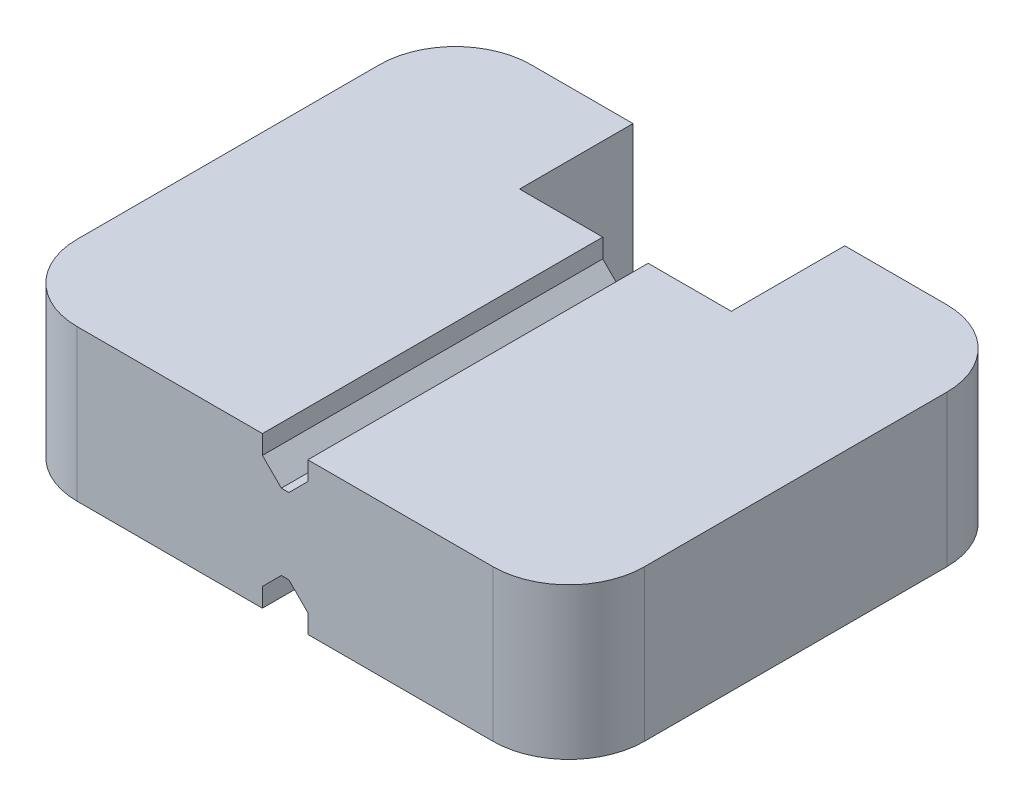
ISO-10303-21;
HEADER;
FILE_DESCRIPTION(('STEP AP214'),'2;1');
FILE_NAME('part.step','',(''),(''),'','','');
FILE_SCHEMA(('AUTOMOTIVE_DESIGN { 1 0 10303 214 1 1 1 1 }'));
ENDSEC;
DATA;
#1=APPLICATION_CONTEXT('core data for automotive mechanical design processes');
#2=APPLICATION_PROTOCOL_DEFINITION('international standard','automotive_design',2000,#1);
#3=PRODUCT_CONTEXT('',#1,'mechanical');
#4=PRODUCT('Part','Part','',(#3));
#5=PRODUCT_RELATED_PRODUCT_CATEGORY('part','',(#4));
#6=PRODUCT_DEFINITION_FORMATION('','',#4);
#7=PRODUCT_DEFINITION_CONTEXT('part definition',#1,'design');
#8=PRODUCT_DEFINITION('design','',#6,#7);
#9=PRODUCT_DEFINITION_SHAPE('','',#8);
#10=(LENGTH_UNIT() NAMED_UNIT(*) SI_UNIT(.MILLI.,.METRE.));
#11=(NAMED_UNIT(*) PLANE_ANGLE_UNIT() SI_UNIT($,.RADIAN.));
#12=(NAMED_UNIT(*) SI_UNIT($,.STERADIAN.) SOLID_ANGLE_UNIT());
#13=UNCERTAINTY_MEASURE_WITH_UNIT(LENGTH_MEASURE(1.E-05),#10,'distance_accuracy_value','');
#14=(GEOMETRIC_REPRESENTATION_CONTEXT(3) GLOBAL_UNCERTAINTY_ASSIGNED_CONTEXT((#13)) GLOBAL_UNIT_ASSIGNED_CONTEXT((#10,
#11,#12)) REPRESENTATION_CONTEXT('',''));
#15=CARTESIAN_POINT('',(0.,0.,0.));
#16=DIRECTION('',(0.,0.,1.));
#17=DIRECTION('',(1.,0.,0.));
#18=AXIS2_PLACEMENT_3D('',#15,#16,#17);
#19=CARTESIAN_POINT('',(0.,0.,0.));
#20=DIRECTION('',(0.,1.,0.));
#21=DIRECTION('',(0.,0.,1.));
#22=AXIS2_PLACEMENT_3D('',#19,#20,#21);
#23=PLANE('',#22);
#24=DIRECTION('',(1.,0.,0.));
#25=VECTOR('',#24,1.);
#26=CARTESIAN_POINT('',(-7.5,0.,6.));
#27=LINE('',#26,#25);
#28=CARTESIAN_POINT('',(0.6,0.,6.));
#29=VERTEX_POINT('',#28);
#30=CARTESIAN_POINT('',(5.49999999999999,0.,6.));
#31=VERTEX_POINT('',#30);
#32=EDGE_CURVE('E262',#29,#31,#27,.T.);
#33=ORIENTED_EDGE('',*,*,#32,.F.);
#34=DIRECTION('',(0.,0.,1.));
#35=VECTOR('',#34,1.);
#36=CARTESIAN_POINT('',(0.6,0.,7.));
#37=LINE('',#36,#35);
#38=CARTESIAN_POINT('',(0.600000000000001,0.,-3.));
#39=VERTEX_POINT('',#38);
#40=EDGE_CURVE('E209',#39,#29,#37,.T.);
#41=ORIENTED_EDGE('',*,*,#40,.F.);
#42=DIRECTION('',(1.,0.,0.));
#43=VECTOR('',#42,1.);
#44=CARTESIAN_POINT('',(-2.8,0.,-3.));
#45=LINE('',#44,#43);
#46=CARTESIAN_POINT('',(2.8,0.,-3.));
#47=VERTEX_POINT('',#46);
#48=EDGE_CURVE('E216',#39,#47,#45,.T.);
#49=ORIENTED_EDGE('',*,*,#48,.T.);
#50=DIRECTION('',(0.,0.,-1.));
#51=VECTOR('',#50,1.);
#52=CARTESIAN_POINT('',(2.8,0.,-9.));
#53=LINE('',#52,#51);
#54=CARTESIAN_POINT('',(2.8,0.,-6.));
#55=VERTEX_POINT('',#54);
#56=EDGE_CURVE('E220',#47,#55,#53,.T.);
#57=ORIENTED_EDGE('',*,*,#56,.T.);
#58=DIRECTION('',(-1.,0.,0.));
#59=VECTOR('',#58,1.);
#60=CARTESIAN_POINT('',(-7.5,0.,-6.));
#61=LINE('',#60,#59);
#62=CARTESIAN_POINT('',(5.5,0.,-6.));
#63=VERTEX_POINT('',#62);
#64=EDGE_CURVE('E258',#63,#55,#61,.T.);
#65=ORIENTED_EDGE('',*,*,#64,.F.);
#66=CARTESIAN_POINT('',(5.5,0.,-4.));
#67=DIRECTION('',(0.,1.,0.));
#68=DIRECTION('',(0.,0.,1.));
#69=AXIS2_PLACEMENT_3D('',#66,#67,#68);
#70=CIRCLE('',#69,2.);
#71=CARTESIAN_POINT('',(7.5,0.,-4.));
#72=VERTEX_POINT('',#71);
#73=EDGE_CURVE('E302',#63,#72,#70,.F.);
#74=ORIENTED_EDGE('',*,*,#73,.T.);
#75=DIRECTION('',(0.,0.,-1.));
#76=VECTOR('',#75,1.);
#77=CARTESIAN_POINT('',(7.5,0.,-6.));
#78=LINE('',#77,#76);
#79=CARTESIAN_POINT('',(7.5,0.,4.));
#80=VERTEX_POINT('',#79);
#81=EDGE_CURVE('E242',#80,#72,#78,.T.);
#82=ORIENTED_EDGE('',*,*,#81,.F.);
#83=CARTESIAN_POINT('',(5.5,0.,4.));
#84=DIRECTION('',(0.,1.,0.));
#85=DIRECTION('',(0.,0.,1.));
#86=AXIS2_PLACEMENT_3D('',#83,#84,#85);
#87=CIRCLE('',#86,2.);
#88=EDGE_CURVE('E291',#80,#31,#87,.F.);
#89=ORIENTED_EDGE('',*,*,#88,.T.);
#90=EDGE_LOOP('',(#33,#41,#49,#57,#65,#74,#82,#89));
#91=FACE_BOUND('',#90,.T.);
#92=ADVANCED_FACE('F35',(#91),#23,.F.);
#93=CARTESIAN_POINT('',(-5.5,4.,-4.));
#94=DIRECTION('',(0.,1.,0.));
#95=DIRECTION('',(0.,0.,1.));
#96=AXIS2_PLACEMENT_3D('',#93,#94,#95);
#97=CYLINDRICAL_SURFACE('',#96,2.);
#98=DIRECTION('',(0.,1.,0.));
#99=VECTOR('',#98,1.);
#100=CARTESIAN_POINT('',(-5.5,4.,-6.));
#101=LINE('',#100,#99);
#102=CARTESIAN_POINT('',(-5.5,0.,-6.));
#103=VERTEX_POINT('',#102);
#104=CARTESIAN_POINT('',(-5.5,4.,-6.));
#105=VERTEX_POINT('',#104);
#106=EDGE_CURVE('E315',#103,#105,#101,.T.);
#107=ORIENTED_EDGE('',*,*,#106,.F.);
#108=CARTESIAN_POINT('',(-5.5,0.,-4.));
#109=DIRECTION('',(0.,1.,0.));
#110=DIRECTION('',(0.,0.,1.));
#111=AXIS2_PLACEMENT_3D('',#108,#109,#110);
#112=CIRCLE('',#111,2.);
#113=CARTESIAN_POINT('',(-7.5,0.,-4.));
#114=VERTEX_POINT('',#113);
#115=EDGE_CURVE('E321',#114,#103,#112,.F.);
#116=ORIENTED_EDGE('',*,*,#115,.F.);
#117=DIRECTION('',(0.,1.,0.));
#118=VECTOR('',#117,1.);
#119=CARTESIAN_POINT('',(-7.5,4.,-4.));
#120=LINE('',#119,#118);
#121=CARTESIAN_POINT('',(-7.5,4.,-4.));
#122=VERTEX_POINT('',#121);
#123=EDGE_CURVE('E318',#122,#114,#120,.F.);
#124=ORIENTED_EDGE('',*,*,#123,.F.);
#125=CARTESIAN_POINT('',(-5.5,4.,-4.));
#126=DIRECTION('',(0.,1.,0.));
#127=DIRECTION('',(0.,0.,1.));
#128=AXIS2_PLACEMENT_3D('',#125,#126,#127);
#129=CIRCLE('',#128,2.);
#130=EDGE_CURVE('E323',#105,#122,#129,.T.);
#131=ORIENTED_EDGE('',*,*,#130,.F.);
#132=EDGE_LOOP('',(#107,#116,#124,#131));
#133=FACE_BOUND('',#132,.T.);
#134=ADVANCED_FACE('F421',(#133),#97,.T.);
#135=CARTESIAN_POINT('',(-5.5,4.,4.));
#136=DIRECTION('',(0.,1.,0.));
#137=DIRECTION('',(0.,0.,1.));
#138=AXIS2_PLACEMENT_3D('',#135,#136,#137);
#139=CYLINDRICAL_SURFACE('',#138,2.);
#140=DIRECTION('',(0.,1.,0.));
#141=VECTOR('',#140,1.);
#142=CARTESIAN_POINT('',(-7.5,4.,4.));
#143=LINE('',#142,#141);
#144=CARTESIAN_POINT('',(-7.5,0.,4.));
#145=VERTEX_POINT('',#144);
#146=CARTESIAN_POINT('',(-7.5,4.,4.));
#147=VERTEX_POINT('',#146);
#148=EDGE_CURVE('E304',#145,#147,#143,.T.);
#149=ORIENTED_EDGE('',*,*,#148,.F.);
#150=CARTESIAN_POINT('',(-5.5,0.,4.));
#151=DIRECTION('',(0.,1.,0.));
#152=DIRECTION('',(0.,0.,1.));
#153=AXIS2_PLACEMENT_3D('',#150,#151,#152);
#154=CIRCLE('',#153,2.);
#155=CARTESIAN_POINT('',(-5.5,0.,6.));
#156=VERTEX_POINT('',#155);
#157=EDGE_CURVE('E310',#156,#145,#154,.F.);
#158=ORIENTED_EDGE('',*,*,#157,.F.);
#159=DIRECTION('',(0.,1.,0.));
#160=VECTOR('',#159,1.);
#161=CARTESIAN_POINT('',(-5.5,4.,6.));
#162=LINE('',#161,#160);
#163=CARTESIAN_POINT('',(-5.5,4.,6.));
#164=VERTEX_POINT('',#163);
#165=EDGE_CURVE('E307',#164,#156,#162,.F.);
#166=ORIENTED_EDGE('',*,*,#165,.F.);
#167=CARTESIAN_POINT('',(-5.5,4.,4.));
#168=DIRECTION('',(0.,1.,0.));
#169=DIRECTION('',(0.,0.,1.));
#170=AXIS2_PLACEMENT_3D('',#167,#168,#169);
#171=CIRCLE('',#170,2.);
#172=EDGE_CURVE('E313',#147,#164,#171,.T.);
#173=ORIENTED_EDGE('',*,*,#172,.F.);
#174=EDGE_LOOP('',(#149,#158,#166,#173));
#175=FACE_BOUND('',#174,.T.);
#176=ADVANCED_FACE('F429',(#175),#139,.T.);
#177=CARTESIAN_POINT('',(5.5,4.,-4.));
#178=DIRECTION('',(0.,-1.,0.));
#179=DIRECTION('',(0.,0.,-1.));
#180=AXIS2_PLACEMENT_3D('',#177,#178,#179);
#181=CYLINDRICAL_SURFACE('',#180,2.);
#182=DIRECTION('',(0.,-1.,0.));
#183=VECTOR('',#182,1.);
#184=CARTESIAN_POINT('',(5.5,4.,-6.));
#185=LINE('',#184,#183);
#186=CARTESIAN_POINT('',(5.5,4.,-6.));
#187=VERTEX_POINT('',#186);
#188=EDGE_CURVE('E294',#187,#63,#185,.T.);
#189=ORIENTED_EDGE('',*,*,#188,.F.);
#190=CARTESIAN_POINT('',(5.5,4.,-4.));
#191=DIRECTION('',(0.,1.,0.));
#192=DIRECTION('',(0.,0.,1.));
#193=AXIS2_PLACEMENT_3D('',#190,#191,#192);
#194=CIRCLE('',#193,2.);
#195=CARTESIAN_POINT('',(7.5,4.,-4.));
#196=VERTEX_POINT('',#195);
#197=EDGE_CURVE('E300',#196,#187,#194,.T.);
#198=ORIENTED_EDGE('',*,*,#197,.F.);
#199=DIRECTION('',(0.,-1.,0.));
#200=VECTOR('',#199,1.);
#201=CARTESIAN_POINT('',(7.5,4.,-4.));
#202=LINE('',#201,#200);
#203=EDGE_CURVE('E297',#72,#196,#202,.F.);
#204=ORIENTED_EDGE('',*,*,#203,.F.);
#205=ORIENTED_EDGE('',*,*,#73,.F.);
#206=EDGE_LOOP('',(#189,#198,#204,#205));
#207=FACE_BOUND('',#206,.T.);
#208=ADVANCED_FACE('F470',(#207),#181,.T.);
#209=CARTESIAN_POINT('',(5.5,4.,4.));
#210=DIRECTION('',(0.,-1.,0.));
#211=DIRECTION('',(0.,0.,-1.));
#212=AXIS2_PLACEMENT_3D('',#209,#210,#211);
#213=CYLINDRICAL_SURFACE('',#212,2.);
#214=DIRECTION('',(0.,-1.,0.));
#215=VECTOR('',#214,1.);
#216=CARTESIAN_POINT('',(7.5,4.,4.));
#217=LINE('',#216,#215);
#218=CARTESIAN_POINT('',(7.5,4.,4.));
#219=VERTEX_POINT('',#218);
#220=EDGE_CURVE('E283',#219,#80,#217,.T.);
#221=ORIENTED_EDGE('',*,*,#220,.F.);
#222=CARTESIAN_POINT('',(5.5,4.,4.));
#223=DIRECTION('',(0.,1.,0.));
#224=DIRECTION('',(0.,0.,1.));
#225=AXIS2_PLACEMENT_3D('',#222,#223,#224);
#226=CIRCLE('',#225,2.);
#227=CARTESIAN_POINT('',(5.49999999999999,4.,6.));
#228=VERTEX_POINT('',#227);
#229=EDGE_CURVE('E289',#228,#219,#226,.T.);
#230=ORIENTED_EDGE('',*,*,#229,.F.);
#231=DIRECTION('',(0.,-1.,0.));
#232=VECTOR('',#231,1.);
#233=CARTESIAN_POINT('',(5.5,4.,6.));
#234=LINE('',#233,#232);
#235=EDGE_CURVE('E286',#31,#228,#234,.F.);
#236=ORIENTED_EDGE('',*,*,#235,.F.);
#237=ORIENTED_EDGE('',*,*,#88,.F.);
#238=EDGE_LOOP('',(#221,#230,#236,#237));
#239=FACE_BOUND('',#238,.T.);
#240=ADVANCED_FACE('F461',(#239),#213,.T.);
#241=CARTESIAN_POINT('',(0.,4.,0.));
#242=DIRECTION('',(0.,1.,0.));
#243=DIRECTION('',(0.,0.,1.));
#244=AXIS2_PLACEMENT_3D('',#241,#242,#243);
#245=PLANE('',#244);
#246=DIRECTION('',(0.,0.,-1.));
#247=VECTOR('',#246,1.);
#248=CARTESIAN_POINT('',(7.5,4.,-6.));
#249=LINE('',#248,#247);
#250=EDGE_CURVE('E243',#219,#196,#249,.T.);
#251=ORIENTED_EDGE('',*,*,#250,.T.);
#252=ORIENTED_EDGE('',*,*,#197,.T.);
#253=DIRECTION('',(-1.,0.,0.));
#254=VECTOR('',#253,1.);
#255=CARTESIAN_POINT('',(-7.5,4.,-6.));
#256=LINE('',#255,#254);
#257=CARTESIAN_POINT('',(2.8,4.,-6.));
#258=VERTEX_POINT('',#257);
#259=EDGE_CURVE('E248',#187,#258,#256,.T.);
#260=ORIENTED_EDGE('',*,*,#259,.T.);
#261=DIRECTION('',(0.,0.,-1.));
#262=VECTOR('',#261,1.);
#263=CARTESIAN_POINT('',(2.8,4.,-9.));
#264=LINE('',#263,#262);
#265=CARTESIAN_POINT('',(2.8,4.,-3.));
#266=VERTEX_POINT('',#265);
#267=EDGE_CURVE('E224',#266,#258,#264,.T.);
#268=ORIENTED_EDGE('',*,*,#267,.F.);
#269=DIRECTION('',(1.,0.,0.));
#270=VECTOR('',#269,1.);
#271=CARTESIAN_POINT('',(-2.8,4.,-3.));
#272=LINE('',#271,#270);
#273=CARTESIAN_POINT('',(0.600000000000004,4.,-3.));
#274=VERTEX_POINT('',#273);
#275=EDGE_CURVE('E230',#274,#266,#272,.T.);
#276=ORIENTED_EDGE('',*,*,#275,.F.);
#277=DIRECTION('',(0.,0.,-1.));
#278=VECTOR('',#277,1.);
#279=CARTESIAN_POINT('',(0.600000000000004,4.,7.));
#280=LINE('',#279,#278);
#281=CARTESIAN_POINT('',(0.600000000000004,4.,6.));
#282=VERTEX_POINT('',#281);
#283=EDGE_CURVE('E360',#282,#274,#280,.T.);
#284=ORIENTED_EDGE('',*,*,#283,.F.);
#285=DIRECTION('',(1.,0.,0.));
#286=VECTOR('',#285,1.);
#287=CARTESIAN_POINT('',(-7.5,4.,6.));
#288=LINE('',#287,#286);
#289=EDGE_CURVE('E252',#282,#228,#288,.T.);
#290=ORIENTED_EDGE('',*,*,#289,.T.);
#291=ORIENTED_EDGE('',*,*,#229,.T.);
#292=EDGE_LOOP('',(#251,#252,#260,#268,#276,#284,#290,#291));
#293=FACE_BOUND('',#292,.T.);
#294=ADVANCED_FACE('F455',(#293),#245,.T.);
#295=CARTESIAN_POINT('',(-7.5,4.,-6.));
#296=DIRECTION('',(0.,0.,1.));
#297=DIRECTION('',(1.,0.,0.));
#298=AXIS2_PLACEMENT_3D('',#295,#296,#297);
#299=PLANE('',#298);
#300=ORIENTED_EDGE('',*,*,#259,.F.);
#301=ORIENTED_EDGE('',*,*,#188,.T.);
#302=ORIENTED_EDGE('',*,*,#64,.T.);
#303=DIRECTION('',(0.,1.,0.));
#304=VECTOR('',#303,1.);
#305=CARTESIAN_POINT('',(2.8,4.,-6.));
#306=LINE('',#305,#304);
#307=EDGE_CURVE('E239',#55,#258,#306,.T.);
#308=ORIENTED_EDGE('',*,*,#307,.T.);
#309=EDGE_LOOP('',(#300,#301,#302,#308));
#310=FACE_BOUND('',#309,.T.);
#311=ADVANCED_FACE('F460',(#310),#299,.F.);
#312=CARTESIAN_POINT('',(7.5,4.,-6.));
#313=DIRECTION('',(-1.,0.,0.));
#314=DIRECTION('',(0.,0.,1.));
#315=AXIS2_PLACEMENT_3D('',#312,#313,#314);
#316=PLANE('',#315);
#317=ORIENTED_EDGE('',*,*,#81,.T.);
#318=ORIENTED_EDGE('',*,*,#203,.T.);
#319=ORIENTED_EDGE('',*,*,#250,.F.);
#320=ORIENTED_EDGE('',*,*,#220,.T.);
#321=EDGE_LOOP('',(#317,#318,#319,#320));
#322=FACE_BOUND('',#321,.T.);
#323=ADVANCED_FACE('F467',(#322),#316,.F.);
#324=CARTESIAN_POINT('',(-2.8,0.,-6.));
#325=VERTEX_POINT('',#324);
#326=EDGE_CURVE('E257',#325,#103,#61,.T.);
#327=ORIENTED_EDGE('',*,*,#326,.T.);
#328=ORIENTED_EDGE('',*,*,#106,.T.);
#329=CARTESIAN_POINT('',(-2.8,4.,-6.));
#330=VERTEX_POINT('',#329);
#331=EDGE_CURVE('E246',#330,#105,#256,.T.);
#332=ORIENTED_EDGE('',*,*,#331,.F.);
#333=DIRECTION('',(0.,-1.,0.));
#334=VECTOR('',#333,1.);
#335=CARTESIAN_POINT('',(-2.8,4.,-6.));
#336=LINE('',#335,#334);
#337=EDGE_CURVE('E235',#330,#325,#336,.T.);
#338=ORIENTED_EDGE('',*,*,#337,.T.);
#339=EDGE_LOOP('',(#327,#328,#332,#338));
#340=FACE_BOUND('',#339,.T.);
#341=ADVANCED_FACE('F418',(#340),#299,.F.);
#342=CARTESIAN_POINT('',(-7.5,4.,-6.));
#343=DIRECTION('',(1.,0.,0.));
#344=DIRECTION('',(0.,0.,-1.));
#345=AXIS2_PLACEMENT_3D('',#342,#343,#344);
#346=PLANE('',#345);
#347=DIRECTION('',(0.,0.,1.));
#348=VECTOR('',#347,1.);
#349=CARTESIAN_POINT('',(-7.5,4.,-6.));
#350=LINE('',#349,#348);
#351=EDGE_CURVE('E250',#122,#147,#350,.T.);
#352=ORIENTED_EDGE('',*,*,#351,.F.);
#353=ORIENTED_EDGE('',*,*,#123,.T.);
#354=DIRECTION('',(0.,0.,1.));
#355=VECTOR('',#354,1.);
#356=CARTESIAN_POINT('',(-7.5,0.,-6.));
#357=LINE('',#356,#355);
#358=EDGE_CURVE('E260',#114,#145,#357,.T.);
#359=ORIENTED_EDGE('',*,*,#358,.T.);
#360=ORIENTED_EDGE('',*,*,#148,.T.);
#361=EDGE_LOOP('',(#352,#353,#359,#360));
#362=FACE_BOUND('',#361,.T.);
#363=ADVANCED_FACE('F430',(#362),#346,.F.);
#364=CARTESIAN_POINT('',(-7.5,4.,6.));
#365=DIRECTION('',(0.,0.,-1.));
#366=DIRECTION('',(-1.,0.,0.));
#367=AXIS2_PLACEMENT_3D('',#364,#365,#366);
#368=PLANE('',#367);
#369=DIRECTION('',(-1.,0.,0.));
#370=VECTOR('',#369,1.);
#371=CARTESIAN_POINT('',(-7.5,1.,6.));
#372=LINE('',#371,#370);
#373=CARTESIAN_POINT('',(0.0999999999999977,1.,6.));
#374=VERTEX_POINT('',#373);
#375=CARTESIAN_POINT('',(-0.0999999999999977,1.,6.));
#376=VERTEX_POINT('',#375);
#377=EDGE_CURVE('E355',#374,#376,#372,.T.);
#378=ORIENTED_EDGE('',*,*,#377,.F.);
#379=DIRECTION('',(0.707106781186551,-0.707106781186544,0.));
#380=VECTOR('',#379,1.);
#381=CARTESIAN_POINT('',(-5.20000000000004,6.29999999999998,6.));
#382=LINE('',#381,#380);
#383=CARTESIAN_POINT('',(0.6,0.500000000000003,6.));
#384=VERTEX_POINT('',#383);
#385=EDGE_CURVE('E334',#374,#384,#382,.T.);
#386=ORIENTED_EDGE('',*,*,#385,.T.);
#387=DIRECTION('',(0.,-1.,0.));
#388=VECTOR('',#387,1.);
#389=CARTESIAN_POINT('',(0.6,4.,6.));
#390=LINE('',#389,#388);
#391=EDGE_CURVE('E353',#384,#29,#390,.T.);
#392=ORIENTED_EDGE('',*,*,#391,.T.);
#393=ORIENTED_EDGE('',*,*,#32,.T.);
#394=ORIENTED_EDGE('',*,*,#235,.T.);
#395=ORIENTED_EDGE('',*,*,#289,.F.);
#396=DIRECTION('',(0.,-1.,0.));
#397=VECTOR('',#396,1.);
#398=CARTESIAN_POINT('',(0.600000000000003,4.,6.));
#399=LINE('',#398,#397);
#400=CARTESIAN_POINT('',(0.600000000000003,3.5,6.));
#401=VERTEX_POINT('',#400);
#402=EDGE_CURVE('E228',#282,#401,#399,.T.);
#403=ORIENTED_EDGE('',*,*,#402,.T.);
#404=DIRECTION('',(0.707106781186551,0.707106781186544,0.));
#405=VECTOR('',#404,1.);
#406=CARTESIAN_POINT('',(-3.20000000000004,-0.300000000000003,6.));
#407=LINE('',#406,#405);
#408=CARTESIAN_POINT('',(0.0999999999999977,3.,6.));
#409=VERTEX_POINT('',#408);
#410=EDGE_CURVE('E277',#401,#409,#407,.F.);
#411=ORIENTED_EDGE('',*,*,#410,.T.);
#412=DIRECTION('',(-1.,0.,0.));
#413=VECTOR('',#412,1.);
#414=CARTESIAN_POINT('',(-7.5,3.,6.));
#415=LINE('',#414,#413);
#416=CARTESIAN_POINT('',(-0.0999999999999907,3.,6.));
#417=VERTEX_POINT('',#416);
#418=EDGE_CURVE('E376',#409,#417,#415,.T.);
#419=ORIENTED_EDGE('',*,*,#418,.T.);
#420=DIRECTION('',(0.707106781186551,-0.707106781186544,0.));
#421=VECTOR('',#420,1.);
#422=CARTESIAN_POINT('',(-4.30000000000003,7.2,6.));
#423=LINE('',#422,#421);
#424=CARTESIAN_POINT('',(-0.599999999999996,3.5,6.));
#425=VERTEX_POINT('',#424);
#426=EDGE_CURVE('E279',#417,#425,#423,.F.);
#427=ORIENTED_EDGE('',*,*,#426,.T.);
#428=DIRECTION('',(0.,1.,0.));
#429=VECTOR('',#428,1.);
#430=CARTESIAN_POINT('',(-0.599999999999996,4.,6.));
#431=LINE('',#430,#429);
#432=CARTESIAN_POINT('',(-0.599999999999996,4.,6.));
#433=VERTEX_POINT('',#432);
#434=EDGE_CURVE('E380',#425,#433,#431,.T.);
#435=ORIENTED_EDGE('',*,*,#434,.T.);
#436=EDGE_CURVE('E253',#164,#433,#288,.T.);
#437=ORIENTED_EDGE('',*,*,#436,.F.);
#438=ORIENTED_EDGE('',*,*,#165,.T.);
#439=CARTESIAN_POINT('',(-0.6,0.,6.));
#440=VERTEX_POINT('',#439);
#441=EDGE_CURVE('E247',#156,#440,#27,.T.);
#442=ORIENTED_EDGE('',*,*,#441,.T.);
#443=DIRECTION('',(0.,1.,0.));
#444=VECTOR('',#443,1.);
#445=CARTESIAN_POINT('',(-0.600000000000001,4.,6.));
#446=LINE('',#445,#444);
#447=CARTESIAN_POINT('',(-0.600000000000001,0.500000000000003,6.));
#448=VERTEX_POINT('',#447);
#449=EDGE_CURVE('E205',#440,#448,#446,.T.);
#450=ORIENTED_EDGE('',*,*,#449,.T.);
#451=DIRECTION('',(0.707106781186551,0.707106781186544,0.));
#452=VECTOR('',#451,1.);
#453=CARTESIAN_POINT('',(-2.30000000000004,-1.20000000000002,6.));
#454=LINE('',#453,#452);
#455=EDGE_CURVE('E11',#448,#376,#454,.T.);
#456=ORIENTED_EDGE('',*,*,#455,.T.);
#457=EDGE_LOOP('',(#378,#386,#392,#393,#394,#395,#403,#411,#419,#427,#435,#437,#438,#442,#450,#456));
#458=FACE_BOUND('',#457,.T.);
#459=ADVANCED_FACE('F352',(#458),#368,.F.);
#460=ORIENTED_EDGE('',*,*,#331,.T.);
#461=ORIENTED_EDGE('',*,*,#130,.T.);
#462=ORIENTED_EDGE('',*,*,#351,.T.);
#463=ORIENTED_EDGE('',*,*,#172,.T.);
#464=ORIENTED_EDGE('',*,*,#436,.T.);
#465=DIRECTION('',(0.,0.,1.));
#466=VECTOR('',#465,1.);
#467=CARTESIAN_POINT('',(-0.599999999999996,4.,7.));
#468=LINE('',#467,#466);
#469=CARTESIAN_POINT('',(-0.599999999999996,4.,-3.));
#470=VERTEX_POINT('',#469);
#471=EDGE_CURVE('E363',#470,#433,#468,.T.);
#472=ORIENTED_EDGE('',*,*,#471,.F.);
#473=CARTESIAN_POINT('',(-2.8,4.,-3.));
#474=VERTEX_POINT('',#473);
#475=EDGE_CURVE('E231',#474,#470,#272,.T.);
#476=ORIENTED_EDGE('',*,*,#475,.F.);
#477=DIRECTION('',(0.,0.,1.));
#478=VECTOR('',#477,1.);
#479=CARTESIAN_POINT('',(-2.8,4.,-9.));
#480=LINE('',#479,#478);
#481=EDGE_CURVE('E227',#330,#474,#480,.T.);
#482=ORIENTED_EDGE('',*,*,#481,.F.);
#483=EDGE_LOOP('',(#460,#461,#462,#463,#464,#472,#476,#482));
#484=FACE_BOUND('',#483,.T.);
#485=ADVANCED_FACE('F411',(#484),#245,.T.);
#486=CARTESIAN_POINT('',(-2.8,0.,-3.));
#487=VERTEX_POINT('',#486);
#488=CARTESIAN_POINT('',(-0.599999999999999,0.,-3.));
#489=VERTEX_POINT('',#488);
#490=EDGE_CURVE('E197',#487,#489,#45,.T.);
#491=ORIENTED_EDGE('',*,*,#490,.T.);
#492=DIRECTION('',(0.,0.,-1.));
#493=VECTOR('',#492,1.);
#494=CARTESIAN_POINT('',(-0.6,0.,7.));
#495=LINE('',#494,#493);
#496=EDGE_CURVE('E203',#440,#489,#495,.T.);
#497=ORIENTED_EDGE('',*,*,#496,.F.);
#498=ORIENTED_EDGE('',*,*,#441,.F.);
#499=ORIENTED_EDGE('',*,*,#157,.T.);
#500=ORIENTED_EDGE('',*,*,#358,.F.);
#501=ORIENTED_EDGE('',*,*,#115,.T.);
#502=ORIENTED_EDGE('',*,*,#326,.F.);
#503=DIRECTION('',(0.,0.,1.));
#504=VECTOR('',#503,1.);
#505=CARTESIAN_POINT('',(-2.8,0.,0.));
#506=LINE('',#505,#504);
#507=EDGE_CURVE('E214',#325,#487,#506,.T.);
#508=ORIENTED_EDGE('',*,*,#507,.T.);
#509=EDGE_LOOP('',(#491,#497,#498,#499,#500,#501,#502,#508));
#510=FACE_BOUND('',#509,.T.);
#511=ADVANCED_FACE('F212',(#510),#23,.F.);
#512=CARTESIAN_POINT('',(2.8,0.,-9.));
#513=DIRECTION('',(1.,0.,0.));
#514=DIRECTION('',(0.,0.,-1.));
#515=AXIS2_PLACEMENT_3D('',#512,#513,#514);
#516=PLANE('',#515);
#517=ORIENTED_EDGE('',*,*,#56,.F.);
#518=DIRECTION('',(0.,1.,0.));
#519=VECTOR('',#518,1.);
#520=CARTESIAN_POINT('',(2.8,0.,-3.));
#521=LINE('',#520,#519);
#522=EDGE_CURVE('E218',#47,#266,#521,.T.);
#523=ORIENTED_EDGE('',*,*,#522,.T.);
#524=ORIENTED_EDGE('',*,*,#267,.T.);
#525=ORIENTED_EDGE('',*,*,#307,.F.);
#526=EDGE_LOOP('',(#517,#523,#524,#525));
#527=FACE_BOUND('',#526,.T.);
#528=ADVANCED_FACE('F448',(#527),#516,.F.);
#529=CARTESIAN_POINT('',(-2.8,0.,-9.));
#530=DIRECTION('',(-1.,0.,0.));
#531=DIRECTION('',(0.,0.,1.));
#532=AXIS2_PLACEMENT_3D('',#529,#530,#531);
#533=PLANE('',#532);
#534=ORIENTED_EDGE('',*,*,#481,.T.);
#535=DIRECTION('',(0.,1.,0.));
#536=VECTOR('',#535,1.);
#537=CARTESIAN_POINT('',(-2.8,0.,-3.));
#538=LINE('',#537,#536);
#539=EDGE_CURVE('E215',#487,#474,#538,.T.);
#540=ORIENTED_EDGE('',*,*,#539,.F.);
#541=ORIENTED_EDGE('',*,*,#507,.F.);
#542=ORIENTED_EDGE('',*,*,#337,.F.);
#543=EDGE_LOOP('',(#534,#540,#541,#542));
#544=FACE_BOUND('',#543,.T.);
#545=ADVANCED_FACE('F414',(#544),#533,.F.);
#546=CARTESIAN_POINT('',(-2.8,0.,-3.));
#547=DIRECTION('',(0.,0.,1.));
#548=DIRECTION('',(1.,0.,0.));
#549=AXIS2_PLACEMENT_3D('',#546,#547,#548);
#550=PLANE('',#549);
#551=ORIENTED_EDGE('',*,*,#48,.F.);
#552=DIRECTION('',(0.,-1.,0.));
#553=VECTOR('',#552,1.);
#554=CARTESIAN_POINT('',(0.600000000000001,1.,-3.));
#555=LINE('',#554,#553);
#556=CARTESIAN_POINT('',(0.600000000000001,0.500000000000003,-3.));
#557=VERTEX_POINT('',#556);
#558=EDGE_CURVE('E199',#557,#39,#555,.T.);
#559=ORIENTED_EDGE('',*,*,#558,.F.);
#560=DIRECTION('',(-0.707106781186551,0.707106781186544,0.));
#561=VECTOR('',#560,1.);
#562=CARTESIAN_POINT('',(-0.850000000000015,1.95,-3.));
#563=LINE('',#562,#561);
#564=CARTESIAN_POINT('',(0.0999999999999986,1.,-3.));
#565=VERTEX_POINT('',#564);
#566=EDGE_CURVE('E336',#557,#565,#563,.T.);
#567=ORIENTED_EDGE('',*,*,#566,.T.);
#568=DIRECTION('',(1.,0.,0.));
#569=VECTOR('',#568,1.);
#570=CARTESIAN_POINT('',(-0.599999999999999,1.,-3.));
#571=LINE('',#570,#569);
#572=CARTESIAN_POINT('',(-0.0999999999999969,1.,-3.));
#573=VERTEX_POINT('',#572);
#574=EDGE_CURVE('E200',#573,#565,#571,.T.);
#575=ORIENTED_EDGE('',*,*,#574,.F.);
#576=DIRECTION('',(-0.707106781186551,-0.707106781186544,0.));
#577=VECTOR('',#576,1.);
#578=CARTESIAN_POINT('',(-1.95000000000001,-0.849999999999996,-3.));
#579=LINE('',#578,#577);
#580=CARTESIAN_POINT('',(-0.599999999999999,0.500000000000003,-3.));
#581=VERTEX_POINT('',#580);
#582=EDGE_CURVE('E43',#573,#581,#579,.T.);
#583=ORIENTED_EDGE('',*,*,#582,.T.);
#584=DIRECTION('',(0.,-1.,0.));
#585=VECTOR('',#584,1.);
#586=CARTESIAN_POINT('',(-0.599999999999999,1.,-3.));
#587=LINE('',#586,#585);
#588=EDGE_CURVE('E191',#581,#489,#587,.T.);
#589=ORIENTED_EDGE('',*,*,#588,.T.);
#590=ORIENTED_EDGE('',*,*,#490,.F.);
#591=ORIENTED_EDGE('',*,*,#539,.T.);
#592=ORIENTED_EDGE('',*,*,#475,.T.);
#593=DIRECTION('',(0.,1.,0.));
#594=VECTOR('',#593,1.);
#595=CARTESIAN_POINT('',(-0.599999999999996,3.,-3.));
#596=LINE('',#595,#594);
#597=CARTESIAN_POINT('',(-0.599999999999996,3.5,-3.));
#598=VERTEX_POINT('',#597);
#599=EDGE_CURVE('E374',#598,#470,#596,.T.);
#600=ORIENTED_EDGE('',*,*,#599,.F.);
#601=DIRECTION('',(-0.707106781186551,0.707106781186544,0.));
#602=VECTOR('',#601,1.);
#603=CARTESIAN_POINT('',(0.0499999999999915,2.85000000000002,-3.));
#604=LINE('',#603,#602);
#605=CARTESIAN_POINT('',(-0.0999999999999906,3.,-3.));
#606=VERTEX_POINT('',#605);
#607=EDGE_CURVE('E281',#598,#606,#604,.F.);
#608=ORIENTED_EDGE('',*,*,#607,.T.);
#609=DIRECTION('',(-1.,0.,0.));
#610=VECTOR('',#609,1.);
#611=CARTESIAN_POINT('',(-0.599999999999996,3.,-3.));
#612=LINE('',#611,#610);
#613=CARTESIAN_POINT('',(0.099999999999998,3.,-3.));
#614=VERTEX_POINT('',#613);
#615=EDGE_CURVE('E368',#614,#606,#612,.T.);
#616=ORIENTED_EDGE('',*,*,#615,.F.);
#617=DIRECTION('',(-0.707106781186551,-0.707106781186544,0.));
#618=VECTOR('',#617,1.);
#619=CARTESIAN_POINT('',(-2.85000000000002,0.0500000000000169,-3.));
#620=LINE('',#619,#618);
#621=CARTESIAN_POINT('',(0.600000000000004,3.5,-3.));
#622=VERTEX_POINT('',#621);
#623=EDGE_CURVE('E275',#614,#622,#620,.F.);
#624=ORIENTED_EDGE('',*,*,#623,.T.);
#625=DIRECTION('',(0.,1.,0.));
#626=VECTOR('',#625,1.);
#627=CARTESIAN_POINT('',(0.600000000000004,3.,-3.));
#628=LINE('',#627,#626);
#629=EDGE_CURVE('E370',#622,#274,#628,.T.);
#630=ORIENTED_EDGE('',*,*,#629,.T.);
#631=ORIENTED_EDGE('',*,*,#275,.T.);
#632=ORIENTED_EDGE('',*,*,#522,.F.);
#633=EDGE_LOOP('',(#551,#559,#567,#575,#583,#589,#590,#591,#592,#600,#608,#616,#624,#630,#631,#632));
#634=FACE_BOUND('',#633,.T.);
#635=ADVANCED_FACE('F194',(#634),#550,.F.);
#636=CARTESIAN_POINT('',(0.600000000000004,3.,7.));
#637=DIRECTION('',(1.,0.,0.));
#638=DIRECTION('',(0.,0.,-1.));
#639=AXIS2_PLACEMENT_3D('',#636,#637,#638);
#640=PLANE('',#639);
#641=ORIENTED_EDGE('',*,*,#629,.F.);
#642=DIRECTION('',(0.,0.,1.));
#643=VECTOR('',#642,1.);
#644=CARTESIAN_POINT('',(0.600000000000004,3.5,6.));
#645=LINE('',#644,#643);
#646=EDGE_CURVE('E271',#622,#401,#645,.T.);
#647=ORIENTED_EDGE('',*,*,#646,.T.);
#648=ORIENTED_EDGE('',*,*,#402,.F.);
#649=ORIENTED_EDGE('',*,*,#283,.T.);
#650=EDGE_LOOP('',(#641,#647,#648,#649));
#651=FACE_BOUND('',#650,.T.);
#652=ADVANCED_FACE('F488',(#651),#640,.F.);
#653=CARTESIAN_POINT('',(-0.599999999999996,3.,7.));
#654=DIRECTION('',(-1.,0.,0.));
#655=DIRECTION('',(0.,0.,1.));
#656=AXIS2_PLACEMENT_3D('',#653,#654,#655);
#657=PLANE('',#656);
#658=ORIENTED_EDGE('',*,*,#434,.F.);
#659=DIRECTION('',(0.,0.,-1.));
#660=VECTOR('',#659,1.);
#661=CARTESIAN_POINT('',(-0.599999999999996,3.5,-3.));
#662=LINE('',#661,#660);
#663=EDGE_CURVE('E273',#425,#598,#662,.T.);
#664=ORIENTED_EDGE('',*,*,#663,.T.);
#665=ORIENTED_EDGE('',*,*,#599,.T.);
#666=ORIENTED_EDGE('',*,*,#471,.T.);
#667=EDGE_LOOP('',(#658,#664,#665,#666));
#668=FACE_BOUND('',#667,.T.);
#669=ADVANCED_FACE('F406',(#668),#657,.F.);
#670=CARTESIAN_POINT('',(0.,3.,0.));
#671=DIRECTION('',(0.,-1.,0.));
#672=DIRECTION('',(0.,0.,-1.));
#673=AXIS2_PLACEMENT_3D('',#670,#671,#672);
#674=PLANE('',#673);
#675=ORIENTED_EDGE('',*,*,#418,.F.);
#676=DIRECTION('',(0.,0.,-1.));
#677=VECTOR('',#676,1.);
#678=CARTESIAN_POINT('',(0.099999999999998,3.,-3.));
#679=LINE('',#678,#677);
#680=EDGE_CURVE('E268',#409,#614,#679,.T.);
#681=ORIENTED_EDGE('',*,*,#680,.T.);
#682=ORIENTED_EDGE('',*,*,#615,.T.);
#683=DIRECTION('',(0.,0.,1.));
#684=VECTOR('',#683,1.);
#685=CARTESIAN_POINT('',(-0.0999999999999906,3.,6.));
#686=LINE('',#685,#684);
#687=EDGE_CURVE('E265',#606,#417,#686,.T.);
#688=ORIENTED_EDGE('',*,*,#687,.T.);
#689=EDGE_LOOP('',(#675,#681,#682,#688));
#690=FACE_BOUND('',#689,.T.);
#691=ADVANCED_FACE('F395',(#690),#674,.F.);
#692=CARTESIAN_POINT('',(0.099999999999998,3.,0.));
#693=DIRECTION('',(-0.707106781186544,0.707106781186551,0.));
#694=DIRECTION('',(0.,0.,1.));
#695=AXIS2_PLACEMENT_3D('',#692,#693,#694);
#696=PLANE('',#695);
#697=ORIENTED_EDGE('',*,*,#410,.F.);
#698=ORIENTED_EDGE('',*,*,#646,.F.);
#699=ORIENTED_EDGE('',*,*,#623,.F.);
#700=ORIENTED_EDGE('',*,*,#680,.F.);
#701=EDGE_LOOP('',(#697,#698,#699,#700));
#702=FACE_BOUND('',#701,.T.);
#703=ADVANCED_FACE('F392',(#702),#696,.T.);
#704=CARTESIAN_POINT('',(-0.0999999999999906,3.,0.));
#705=DIRECTION('',(0.707106781186544,0.707106781186551,0.));
#706=DIRECTION('',(0.,0.,-1.));
#707=AXIS2_PLACEMENT_3D('',#704,#705,#706);
#708=PLANE('',#707);
#709=ORIENTED_EDGE('',*,*,#607,.F.);
#710=ORIENTED_EDGE('',*,*,#663,.F.);
#711=ORIENTED_EDGE('',*,*,#426,.F.);
#712=ORIENTED_EDGE('',*,*,#687,.F.);
#713=EDGE_LOOP('',(#709,#710,#711,#712));
#714=FACE_BOUND('',#713,.T.);
#715=ADVANCED_FACE('F402',(#714),#708,.T.);
#716=CARTESIAN_POINT('',(0.6,1.,7.));
#717=DIRECTION('',(1.,0.,0.));
#718=DIRECTION('',(0.,0.,-1.));
#719=AXIS2_PLACEMENT_3D('',#716,#717,#718);
#720=PLANE('',#719);
#721=ORIENTED_EDGE('',*,*,#391,.F.);
#722=DIRECTION('',(0.,0.,-1.));
#723=VECTOR('',#722,1.);
#724=CARTESIAN_POINT('',(0.6,0.500000000000003,7.));
#725=LINE('',#724,#723);
#726=EDGE_CURVE('E331',#384,#557,#725,.T.);
#727=ORIENTED_EDGE('',*,*,#726,.T.);
#728=ORIENTED_EDGE('',*,*,#558,.T.);
#729=ORIENTED_EDGE('',*,*,#40,.T.);
#730=EDGE_LOOP('',(#721,#727,#728,#729));
#731=FACE_BOUND('',#730,.T.);
#732=ADVANCED_FACE('F357',(#731),#720,.F.);
#733=CARTESIAN_POINT('',(-0.6,1.,7.));
#734=DIRECTION('',(-1.,0.,0.));
#735=DIRECTION('',(0.,0.,1.));
#736=AXIS2_PLACEMENT_3D('',#733,#734,#735);
#737=PLANE('',#736);
#738=ORIENTED_EDGE('',*,*,#588,.F.);
#739=DIRECTION('',(0.,0.,1.));
#740=VECTOR('',#739,1.);
#741=CARTESIAN_POINT('',(-0.6,0.500000000000003,7.));
#742=LINE('',#741,#740);
#743=EDGE_CURVE('E50',#581,#448,#742,.T.);
#744=ORIENTED_EDGE('',*,*,#743,.T.);
#745=ORIENTED_EDGE('',*,*,#449,.F.);
#746=ORIENTED_EDGE('',*,*,#496,.T.);
#747=EDGE_LOOP('',(#738,#744,#745,#746));
#748=FACE_BOUND('',#747,.T.);
#749=ADVANCED_FACE('F204',(#748),#737,.F.);
#750=CARTESIAN_POINT('',(0.,1.,0.));
#751=DIRECTION('',(0.,-1.,0.));
#752=DIRECTION('',(0.,0.,-1.));
#753=AXIS2_PLACEMENT_3D('',#750,#751,#752);
#754=PLANE('',#753);
#755=ORIENTED_EDGE('',*,*,#574,.T.);
#756=DIRECTION('',(0.,0.,1.));
#757=VECTOR('',#756,1.);
#758=CARTESIAN_POINT('',(0.0999999999999983,1.,0.));
#759=LINE('',#758,#757);
#760=EDGE_CURVE('E328',#565,#374,#759,.T.);
#761=ORIENTED_EDGE('',*,*,#760,.T.);
#762=ORIENTED_EDGE('',*,*,#377,.T.);
#763=DIRECTION('',(0.,0.,-1.));
#764=VECTOR('',#763,1.);
#765=CARTESIAN_POINT('',(-0.0999999999999973,1.,0.));
#766=LINE('',#765,#764);
#767=EDGE_CURVE('E325',#376,#573,#766,.T.);
#768=ORIENTED_EDGE('',*,*,#767,.T.);
#769=EDGE_LOOP('',(#755,#761,#762,#768));
#770=FACE_BOUND('',#769,.T.);
#771=ADVANCED_FACE('F344',(#770),#754,.T.);
#772=CARTESIAN_POINT('',(0.0999999999999983,1.,0.));
#773=DIRECTION('',(0.707106781186544,0.707106781186551,0.));
#774=DIRECTION('',(0.,0.,1.));
#775=AXIS2_PLACEMENT_3D('',#772,#773,#774);
#776=PLANE('',#775);
#777=ORIENTED_EDGE('',*,*,#566,.F.);
#778=ORIENTED_EDGE('',*,*,#726,.F.);
#779=ORIENTED_EDGE('',*,*,#385,.F.);
#780=ORIENTED_EDGE('',*,*,#760,.F.);
#781=EDGE_LOOP('',(#777,#778,#779,#780));
#782=FACE_BOUND('',#781,.T.);
#783=ADVANCED_FACE('F349',(#782),#776,.F.);
#784=CARTESIAN_POINT('',(-0.0999999999999973,1.,0.));
#785=DIRECTION('',(-0.707106781186544,0.707106781186551,0.));
#786=DIRECTION('',(0.,0.,-1.));
#787=AXIS2_PLACEMENT_3D('',#784,#785,#786);
#788=PLANE('',#787);
#789=ORIENTED_EDGE('',*,*,#455,.F.);
#790=ORIENTED_EDGE('',*,*,#743,.F.);
#791=ORIENTED_EDGE('',*,*,#582,.F.);
#792=ORIENTED_EDGE('',*,*,#767,.F.);
#793=EDGE_LOOP('',(#789,#790,#791,#792));
#794=FACE_BOUND('',#793,.T.);
#795=ADVANCED_FACE('F37',(#794),#788,.F.);
#796=CLOSED_SHELL('',(#92,#134,#176,#208,#240,#294,#311,#323,#341,#363,#459,#485,#511,#528,#545,
#635,#652,#669,#691,#703,#715,#732,#749,#771,#783,#795));
#797=MANIFOLD_SOLID_BREP('B2',#796);
#798=ADVANCED_BREP_SHAPE_REPRESENTATION('',(#18,#797),#14);
#799=SHAPE_DEFINITION_REPRESENTATION(#9,#798);
ENDSEC;
END-ISO-10303-21;
